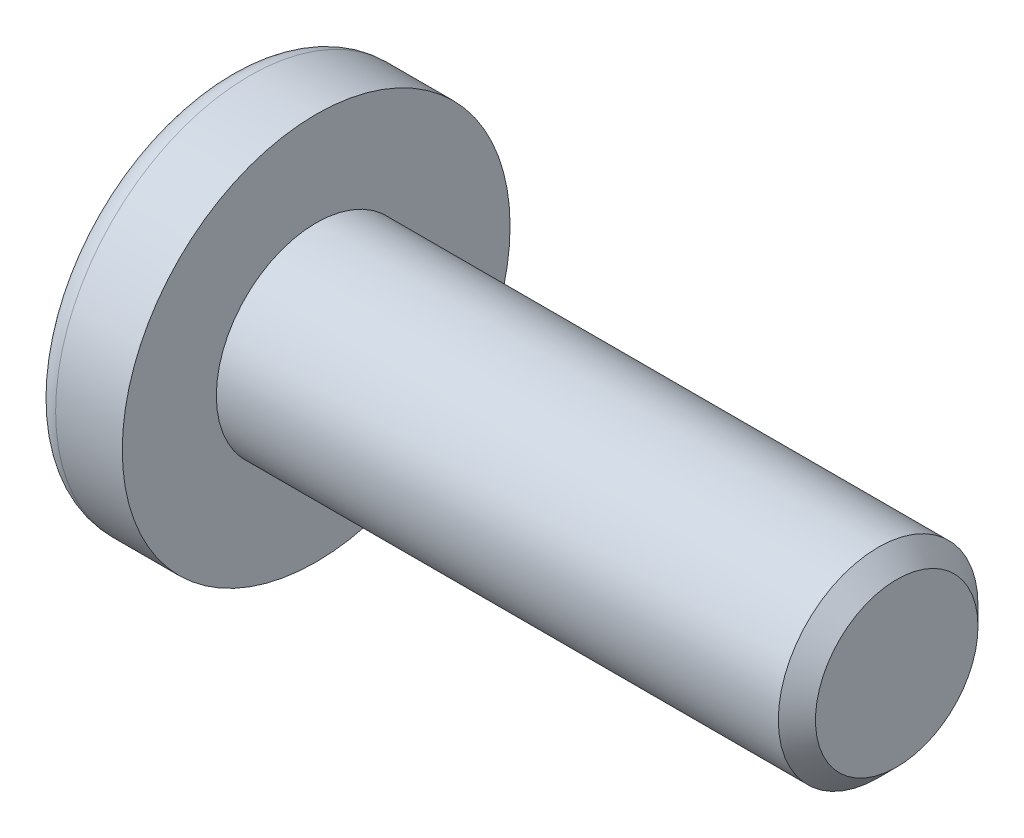
ISO-10303-21;
HEADER;
FILE_DESCRIPTION(('STEP AP214'),'2;1');
FILE_NAME('part.step','',(''),(''),'','','');
FILE_SCHEMA(('AUTOMOTIVE_DESIGN { 1 0 10303 214 1 1 1 1 }'));
ENDSEC;
DATA;
#1=APPLICATION_CONTEXT('core data for automotive mechanical design processes');
#2=APPLICATION_PROTOCOL_DEFINITION('international standard','automotive_design',2000,#1);
#3=PRODUCT_CONTEXT('',#1,'mechanical');
#4=PRODUCT('Part','Part','',(#3));
#5=PRODUCT_RELATED_PRODUCT_CATEGORY('part','',(#4));
#6=PRODUCT_DEFINITION_FORMATION('','',#4);
#7=PRODUCT_DEFINITION_CONTEXT('part definition',#1,'design');
#8=PRODUCT_DEFINITION('design','',#6,#7);
#9=PRODUCT_DEFINITION_SHAPE('','',#8);
#10=(LENGTH_UNIT() NAMED_UNIT(*) SI_UNIT(.MILLI.,.METRE.));
#11=(NAMED_UNIT(*) PLANE_ANGLE_UNIT() SI_UNIT($,.RADIAN.));
#12=(NAMED_UNIT(*) SI_UNIT($,.STERADIAN.) SOLID_ANGLE_UNIT());
#13=UNCERTAINTY_MEASURE_WITH_UNIT(LENGTH_MEASURE(1.E-05),#10,'distance_accuracy_value','');
#14=(GEOMETRIC_REPRESENTATION_CONTEXT(3) GLOBAL_UNCERTAINTY_ASSIGNED_CONTEXT((#13)) GLOBAL_UNIT_ASSIGNED_CONTEXT((#10,
#11,#12)) REPRESENTATION_CONTEXT('',''));
#15=CARTESIAN_POINT('',(0.,0.,0.));
#16=DIRECTION('',(0.,0.,1.));
#17=DIRECTION('',(1.,0.,0.));
#18=AXIS2_PLACEMENT_3D('',#15,#16,#17);
#19=CARTESIAN_POINT('',(3.49504,0.,0.));
#20=DIRECTION('',(-1.,0.,0.));
#21=DIRECTION('',(0.,1.,0.));
#22=AXIS2_PLACEMENT_3D('',#19,#20,#21);
#23=SPHERICAL_SURFACE('',#22,3.49504);
#24=CARTESIAN_POINT('',(0.638066947960321,0.,0.));
#25=DIRECTION('',(-1.,0.,0.));
#26=DIRECTION('',(0.,0.,1.));
#27=AXIS2_PLACEMENT_3D('',#24,#25,#26);
#28=CIRCLE('',#27,2.01320877742947);
#29=CARTESIAN_POINT('',(0.638066947960321,0.,2.01320877742947));
#30=VERTEX_POINT('',#29);
#31=EDGE_CURVE('E143',#30,#30,#28,.T.);
#32=ORIENTED_EDGE('',*,*,#31,.T.);
#33=EDGE_LOOP('',(#32));
#34=FACE_BOUND('',#33,.T.);
#35=CARTESIAN_POINT('',(3.48860800425343,-0.0562204072662827,0.));
#36=DIRECTION('',(-0.113665320353011,-0.99351909641891,0.));
#37=DIRECTION('',(0.99351909641891,-0.113665320353011,0.));
#38=AXIS2_PLACEMENT_3D('',#35,#36,#37);
#39=CIRCLE('',#38,3.49458187725478);
#40=CARTESIAN_POINT('',(0.227775025036725,0.316840992898337,1.19995665346604));
#41=VERTEX_POINT('',#40);
#42=CARTESIAN_POINT('',(0.033060362162214,0.339117670430593,0.339117670430593));
#43=VERTEX_POINT('',#42);
#44=EDGE_CURVE('E139',#41,#43,#39,.T.);
#45=ORIENTED_EDGE('',*,*,#44,.F.);
#46=CARTESIAN_POINT('',(2.78874832810788,0.,-0.872695468934767));
#47=DIRECTION('',(0.629103472698606,0.,0.777321568360582));
#48=DIRECTION('',(0.777321568360582,0.,-0.629103472698606));
#49=AXIS2_PLACEMENT_3D('',#46,#47,#48);
#50=CIRCLE('',#49,3.30981257691679);
#51=CARTESIAN_POINT('',(0.227775025036724,-0.316840992898345,1.19995665346604));
#52=VERTEX_POINT('',#51);
#53=EDGE_CURVE('E131',#41,#52,#50,.T.);
#54=ORIENTED_EDGE('',*,*,#53,.T.);
#55=CARTESIAN_POINT('',(3.48860800425343,0.0562204072662818,0.));
#56=DIRECTION('',(-0.11366532035301,0.99351909641891,0.));
#57=DIRECTION('',(-0.99351909641891,-0.11366532035301,0.));
#58=AXIS2_PLACEMENT_3D('',#55,#56,#57);
#59=CIRCLE('',#58,3.49458187725478);
#60=CARTESIAN_POINT('',(0.0330603621622127,-0.339117670430595,0.339117670430594));
#61=VERTEX_POINT('',#60);
#62=EDGE_CURVE('E383',#61,#52,#59,.T.);
#63=ORIENTED_EDGE('',*,*,#62,.F.);
#64=CARTESIAN_POINT('',(3.48860800425343,0.,-0.0562204072662819));
#65=DIRECTION('',(-0.11366532035301,0.,-0.99351909641891));
#66=DIRECTION('',(-0.99351909641891,0.,0.11366532035301));
#67=AXIS2_PLACEMENT_3D('',#64,#65,#66);
#68=CIRCLE('',#67,3.49458187725478);
#69=CARTESIAN_POINT('',(0.227775025036724,-1.19995665346604,0.316840992898341));
#70=VERTEX_POINT('',#69);
#71=EDGE_CURVE('E177',#70,#61,#68,.T.);
#72=ORIENTED_EDGE('',*,*,#71,.F.);
#73=CARTESIAN_POINT('',(2.78874832810788,0.872695468934764,0.));
#74=DIRECTION('',(0.629103472698606,-0.777321568360582,0.));
#75=DIRECTION('',(0.777321568360582,0.629103472698606,0.));
#76=AXIS2_PLACEMENT_3D('',#73,#74,#75);
#77=CIRCLE('',#76,3.30981257691679);
#78=CARTESIAN_POINT('',(0.227775025036722,-1.19995665346604,-0.316840992898341));
#79=VERTEX_POINT('',#78);
#80=EDGE_CURVE('E173',#70,#79,#77,.T.);
#81=ORIENTED_EDGE('',*,*,#80,.T.);
#82=CARTESIAN_POINT('',(3.48860800425343,0.,0.0562204072662826));
#83=DIRECTION('',(-0.113665320353011,0.,0.99351909641891));
#84=DIRECTION('',(0.99351909641891,0.,0.113665320353011));
#85=AXIS2_PLACEMENT_3D('',#82,#83,#84);
#86=CIRCLE('',#85,3.49458187725478);
#87=CARTESIAN_POINT('',(0.0330603621622127,-0.339117670430592,-0.339117670430594));
#88=VERTEX_POINT('',#87);
#89=EDGE_CURVE('E57',#88,#79,#86,.T.);
#90=ORIENTED_EDGE('',*,*,#89,.F.);
#91=CARTESIAN_POINT('',(0.227775025036724,-0.316840992898336,-1.19995665346604));
#92=VERTEX_POINT('',#91);
#93=EDGE_CURVE('E381',#92,#88,#59,.T.);
#94=ORIENTED_EDGE('',*,*,#93,.F.);
#95=CARTESIAN_POINT('',(2.78874832810788,0.,0.872695468934766));
#96=DIRECTION('',(0.629103472698606,0.,-0.777321568360582));
#97=DIRECTION('',(-0.777321568360582,0.,-0.629103472698606));
#98=AXIS2_PLACEMENT_3D('',#95,#96,#97);
#99=CIRCLE('',#98,3.30981257691679);
#100=CARTESIAN_POINT('',(0.227775025036724,0.316840992898345,-1.19995665346604));
#101=VERTEX_POINT('',#100);
#102=EDGE_CURVE('E388',#92,#101,#99,.T.);
#103=ORIENTED_EDGE('',*,*,#102,.T.);
#104=CARTESIAN_POINT('',(0.033060362162214,0.339117670430595,-0.339117670430594));
#105=VERTEX_POINT('',#104);
#106=EDGE_CURVE('E116',#105,#101,#39,.T.);
#107=ORIENTED_EDGE('',*,*,#106,.F.);
#108=CARTESIAN_POINT('',(0.227775025036726,1.19995665346604,-0.316840992898341));
#109=VERTEX_POINT('',#108);
#110=EDGE_CURVE('E138',#109,#105,#86,.T.);
#111=ORIENTED_EDGE('',*,*,#110,.F.);
#112=CARTESIAN_POINT('',(2.78874832810788,-0.872695468934769,0.));
#113=DIRECTION('',(0.629103472698606,0.777321568360582,0.));
#114=DIRECTION('',(-0.777321568360582,0.629103472698606,0.));
#115=AXIS2_PLACEMENT_3D('',#112,#113,#114);
#116=CIRCLE('',#115,3.30981257691679);
#117=CARTESIAN_POINT('',(0.227775025036726,1.19995665346604,0.31684099289834));
#118=VERTEX_POINT('',#117);
#119=EDGE_CURVE('E65',#109,#118,#116,.T.);
#120=ORIENTED_EDGE('',*,*,#119,.T.);
#121=EDGE_CURVE('E176',#43,#118,#68,.T.);
#122=ORIENTED_EDGE('',*,*,#121,.F.);
#123=EDGE_LOOP('',(#45,#54,#63,#72,#81,#90,#94,#103,#107,#111,#120,#122));
#124=FACE_BOUND('',#123,.T.);
#125=ADVANCED_FACE('F42',(#34,#124),#23,.T.);
#126=CARTESIAN_POINT('',(1.71044397905759,0.,-0.147213612565445));
#127=DIRECTION('',(-0.113665320353011,0.,0.99351909641891));
#128=DIRECTION('',(0.99351909641891,0.,0.113665320353011));
#129=AXIS2_PLACEMENT_3D('',#126,#127,#128);
#130=PLANE('',#129);
#131=ORIENTED_EDGE('',*,*,#110,.T.);
#132=DIRECTION('',(0.987162587649563,-0.112938092654823,0.112938092654823));
#133=VECTOR('',#132,1.);
#134=CARTESIAN_POINT('',(1.72685656853982,0.145335901056886,-0.145335901056885));
#135=LINE('',#134,#133);
#136=CARTESIAN_POINT('',(1.4986,0.171450000000001,-0.17145));
#137=VERTEX_POINT('',#136);
#138=EDGE_CURVE('E114',#105,#137,#135,.T.);
#139=ORIENTED_EDGE('',*,*,#138,.T.);
#140=DIRECTION('',(0.774265880811046,-0.626630437436058,0.0885812660249925));
#141=VECTOR('',#140,1.);
#142=CARTESIAN_POINT('',(0.,1.3843,-0.3429));
#143=LINE('',#142,#141);
#144=EDGE_CURVE('E136',#109,#137,#143,.T.);
#145=ORIENTED_EDGE('',*,*,#144,.F.);
#146=EDGE_LOOP('',(#131,#139,#145));
#147=FACE_BOUND('',#146,.T.);
#148=ADVANCED_FACE('F135',(#147),#130,.T.);
#149=DIRECTION('',(0.774265880811046,0.626630437436058,0.0885812660249925));
#150=VECTOR('',#149,1.);
#151=CARTESIAN_POINT('',(0.,-1.3843,-0.3429));
#152=LINE('',#151,#150);
#153=CARTESIAN_POINT('',(1.4986,-0.17145,-0.17145));
#154=VERTEX_POINT('',#153);
#155=EDGE_CURVE('E158',#79,#154,#152,.T.);
#156=ORIENTED_EDGE('',*,*,#155,.T.);
#157=DIRECTION('',(-0.987162587649563,-0.112938092654822,-0.112938092654823));
#158=VECTOR('',#157,1.);
#159=CARTESIAN_POINT('',(1.72685656853982,-0.145335901056885,-0.145335901056885));
#160=LINE('',#159,#158);
#161=EDGE_CURVE('E372',#154,#88,#160,.T.);
#162=ORIENTED_EDGE('',*,*,#161,.T.);
#163=ORIENTED_EDGE('',*,*,#89,.T.);
#164=EDGE_LOOP('',(#156,#162,#163));
#165=FACE_BOUND('',#164,.T.);
#166=ADVANCED_FACE('F206',(#165),#130,.T.);
#167=CARTESIAN_POINT('',(1.71044397905759,0.,0.147213612565445));
#168=DIRECTION('',(-0.11366532035301,0.,-0.99351909641891));
#169=DIRECTION('',(-0.99351909641891,0.,0.11366532035301));
#170=AXIS2_PLACEMENT_3D('',#167,#168,#169);
#171=PLANE('',#170);
#172=DIRECTION('',(0.774265880811046,-0.626630437436058,-0.0885812660249922));
#173=VECTOR('',#172,1.);
#174=CARTESIAN_POINT('',(0.,1.3843,0.342899999999999));
#175=LINE('',#174,#173);
#176=CARTESIAN_POINT('',(1.4986,0.17145,0.17145));
#177=VERTEX_POINT('',#176);
#178=EDGE_CURVE('E144',#118,#177,#175,.T.);
#179=ORIENTED_EDGE('',*,*,#178,.T.);
#180=DIRECTION('',(-0.987162587649563,0.112938092654822,0.112938092654822));
#181=VECTOR('',#180,1.);
#182=CARTESIAN_POINT('',(1.72685656853981,0.145335901056885,0.145335901056886));
#183=LINE('',#182,#181);
#184=EDGE_CURVE('E378',#177,#43,#183,.T.);
#185=ORIENTED_EDGE('',*,*,#184,.T.);
#186=ORIENTED_EDGE('',*,*,#121,.T.);
#187=EDGE_LOOP('',(#179,#185,#186));
#188=FACE_BOUND('',#187,.T.);
#189=ADVANCED_FACE('F237',(#188),#171,.T.);
#190=ORIENTED_EDGE('',*,*,#71,.T.);
#191=DIRECTION('',(0.987162587649563,0.112938092654823,-0.112938092654822));
#192=VECTOR('',#191,1.);
#193=CARTESIAN_POINT('',(1.72685656853982,-0.145335901056886,0.145335901056886));
#194=LINE('',#193,#192);
#195=CARTESIAN_POINT('',(1.4986,-0.171450000000001,0.171449999999999));
#196=VERTEX_POINT('',#195);
#197=EDGE_CURVE('E385',#61,#196,#194,.T.);
#198=ORIENTED_EDGE('',*,*,#197,.T.);
#199=DIRECTION('',(0.774265880811046,0.626630437436058,-0.0885812660249922));
#200=VECTOR('',#199,1.);
#201=CARTESIAN_POINT('',(0.,-1.3843,0.342899999999999));
#202=LINE('',#201,#200);
#203=EDGE_CURVE('E155',#70,#196,#202,.T.);
#204=ORIENTED_EDGE('',*,*,#203,.F.);
#205=EDGE_LOOP('',(#190,#198,#204));
#206=FACE_BOUND('',#205,.T.);
#207=ADVANCED_FACE('F226',(#206),#171,.T.);
#208=CARTESIAN_POINT('',(-25.4,0.,0.));
#209=DIRECTION('',(-1.,0.,0.));
#210=DIRECTION('',(0.,0.,1.));
#211=AXIS2_PLACEMENT_3D('',#208,#209,#210);
#212=CYLINDRICAL_SURFACE('',#211,1.0922);
#213=CARTESIAN_POINT('',(7.7216,0.,0.));
#214=DIRECTION('',(1.,0.,0.));
#215=DIRECTION('',(0.,0.,-1.));
#216=AXIS2_PLACEMENT_3D('',#213,#214,#215);
#217=CIRCLE('',#216,1.0922);
#218=CARTESIAN_POINT('',(7.7216,0.,-1.0922));
#219=VERTEX_POINT('',#218);
#220=EDGE_CURVE('E50',#219,#219,#217,.F.);
#221=ORIENTED_EDGE('',*,*,#220,.T.);
#222=EDGE_LOOP('',(#221));
#223=FACE_BOUND('',#222,.T.);
#224=CARTESIAN_POINT('',(1.5748,0.,0.));
#225=DIRECTION('',(-1.,0.,0.));
#226=DIRECTION('',(0.,0.,1.));
#227=AXIS2_PLACEMENT_3D('',#224,#225,#226);
#228=CIRCLE('',#227,1.0922);
#229=CARTESIAN_POINT('',(1.5748,0.,1.0922));
#230=VERTEX_POINT('',#229);
#231=EDGE_CURVE('E170',#230,#230,#228,.T.);
#232=ORIENTED_EDGE('',*,*,#231,.F.);
#233=EDGE_LOOP('',(#232));
#234=FACE_BOUND('',#233,.T.);
#235=ADVANCED_FACE('F44',(#223,#234),#212,.T.);
#236=CARTESIAN_POINT('',(1.5748,1.0922,0.));
#237=DIRECTION('',(-1.,0.,0.));
#238=DIRECTION('',(0.,0.,1.));
#239=AXIS2_PLACEMENT_3D('',#236,#237,#238);
#240=PLANE('',#239);
#241=CARTESIAN_POINT('',(1.5748,0.,0.));
#242=DIRECTION('',(-1.,0.,0.));
#243=DIRECTION('',(0.,0.,1.));
#244=AXIS2_PLACEMENT_3D('',#241,#242,#243);
#245=CIRCLE('',#244,2.1209);
#246=CARTESIAN_POINT('',(1.5748,0.,2.1209));
#247=VERTEX_POINT('',#246);
#248=EDGE_CURVE('E167',#247,#247,#245,.T.);
#249=ORIENTED_EDGE('',*,*,#248,.F.);
#250=EDGE_LOOP('',(#249));
#251=FACE_BOUND('',#250,.T.);
#252=ORIENTED_EDGE('',*,*,#231,.T.);
#253=EDGE_LOOP('',(#252));
#254=FACE_BOUND('',#253,.T.);
#255=ADVANCED_FACE('F219',(#251,#254),#240,.F.);
#256=CARTESIAN_POINT('',(-25.4,0.,0.));
#257=DIRECTION('',(-1.,0.,0.));
#258=DIRECTION('',(0.,0.,1.));
#259=AXIS2_PLACEMENT_3D('',#256,#257,#258);
#260=CYLINDRICAL_SURFACE('',#259,2.1209);
#261=ORIENTED_EDGE('',*,*,#248,.T.);
#262=EDGE_LOOP('',(#261));
#263=FACE_BOUND('',#262,.T.);
#264=CARTESIAN_POINT('',(0.845695803486458,0.,0.));
#265=DIRECTION('',(-1.,0.,0.));
#266=DIRECTION('',(0.,0.,1.));
#267=AXIS2_PLACEMENT_3D('',#264,#265,#266);
#268=CIRCLE('',#267,2.1209);
#269=CARTESIAN_POINT('',(0.845695803486458,0.,2.1209));
#270=VERTEX_POINT('',#269);
#271=EDGE_CURVE('E164',#270,#270,#268,.T.);
#272=ORIENTED_EDGE('',*,*,#271,.F.);
#273=EDGE_LOOP('',(#272));
#274=FACE_BOUND('',#273,.T.);
#275=ADVANCED_FACE('F216',(#263,#274),#260,.T.);
#276=CARTESIAN_POINT('',(0.845695803486459,0.,0.));
#277=DIRECTION('',(-1.,0.,0.));
#278=DIRECTION('',(0.,0.,1.));
#279=AXIS2_PLACEMENT_3D('',#276,#277,#278);
#280=TOROIDAL_SURFACE('',#279,1.8669,0.254000000000001);
#281=ORIENTED_EDGE('',*,*,#271,.T.);
#282=EDGE_LOOP('',(#281));
#283=FACE_BOUND('',#282,.T.);
#284=ORIENTED_EDGE('',*,*,#31,.F.);
#285=EDGE_LOOP('',(#284));
#286=FACE_BOUND('',#285,.T.);
#287=ADVANCED_FACE('F213',(#283,#286),#280,.T.);
#288=CARTESIAN_POINT('',(7.9248,1.0922,0.));
#289=DIRECTION('',(1.,0.,0.));
#290=DIRECTION('',(0.,0.,-1.));
#291=AXIS2_PLACEMENT_3D('',#288,#289,#290);
#292=PLANE('',#291);
#293=CARTESIAN_POINT('',(7.9248,0.,0.));
#294=DIRECTION('',(1.,0.,0.));
#295=DIRECTION('',(0.,0.,-1.));
#296=AXIS2_PLACEMENT_3D('',#293,#294,#295);
#297=CIRCLE('',#296,0.888999999999997);
#298=CARTESIAN_POINT('',(7.9248,0.,-0.888999999999997));
#299=VERTEX_POINT('',#298);
#300=EDGE_CURVE('E11',#299,#299,#297,.T.);
#301=ORIENTED_EDGE('',*,*,#300,.T.);
#302=EDGE_LOOP('',(#301));
#303=FACE_BOUND('',#302,.T.);
#304=ADVANCED_FACE('F211',(#303),#292,.T.);
#305=CARTESIAN_POINT('',(1.4986,0.17145,0.17145));
#306=DIRECTION('',(0.629103472698606,0.777321568360582,0.));
#307=DIRECTION('',(-0.777321568360582,0.629103472698606,0.));
#308=AXIS2_PLACEMENT_3D('',#305,#306,#307);
#309=PLANE('',#308);
#310=ORIENTED_EDGE('',*,*,#144,.T.);
#311=DIRECTION('',(0.,0.,-1.));
#312=VECTOR('',#311,1.);
#313=CARTESIAN_POINT('',(1.4986,0.17145,0.17145));
#314=LINE('',#313,#312);
#315=EDGE_CURVE('E130',#177,#137,#314,.T.);
#316=ORIENTED_EDGE('',*,*,#315,.F.);
#317=ORIENTED_EDGE('',*,*,#178,.F.);
#318=ORIENTED_EDGE('',*,*,#119,.F.);
#319=EDGE_LOOP('',(#310,#316,#317,#318));
#320=FACE_BOUND('',#319,.T.);
#321=ADVANCED_FACE('F142',(#320),#309,.F.);
#322=CARTESIAN_POINT('',(0.,-1.3843,-0.3429));
#323=DIRECTION('',(0.629103472698606,-0.777321568360582,0.));
#324=DIRECTION('',(0.777321568360582,0.629103472698606,0.));
#325=AXIS2_PLACEMENT_3D('',#322,#323,#324);
#326=PLANE('',#325);
#327=ORIENTED_EDGE('',*,*,#203,.T.);
#328=DIRECTION('',(0.,0.,1.));
#329=VECTOR('',#328,1.);
#330=CARTESIAN_POINT('',(1.4986,-0.17145,-0.17145));
#331=LINE('',#330,#329);
#332=EDGE_CURVE('E151',#154,#196,#331,.T.);
#333=ORIENTED_EDGE('',*,*,#332,.F.);
#334=ORIENTED_EDGE('',*,*,#155,.F.);
#335=ORIENTED_EDGE('',*,*,#80,.F.);
#336=EDGE_LOOP('',(#327,#333,#334,#335));
#337=FACE_BOUND('',#336,.T.);
#338=ADVANCED_FACE('F245',(#337),#326,.F.);
#339=CARTESIAN_POINT('',(1.4986,0.17145,-0.17145));
#340=DIRECTION('',(-1.,0.,0.));
#341=DIRECTION('',(0.,0.,1.));
#342=AXIS2_PLACEMENT_3D('',#339,#340,#341);
#343=PLANE('',#342);
#344=DIRECTION('',(0.,1.,0.));
#345=VECTOR('',#344,1.);
#346=CARTESIAN_POINT('',(1.4986,-0.17145,-0.17145));
#347=LINE('',#346,#345);
#348=EDGE_CURVE('E123',#154,#137,#347,.T.);
#349=ORIENTED_EDGE('',*,*,#348,.F.);
#350=ORIENTED_EDGE('',*,*,#332,.T.);
#351=DIRECTION('',(0.,-1.,0.));
#352=VECTOR('',#351,1.);
#353=CARTESIAN_POINT('',(1.4986,0.17145,0.17145));
#354=LINE('',#353,#352);
#355=EDGE_CURVE('E149',#177,#196,#354,.T.);
#356=ORIENTED_EDGE('',*,*,#355,.F.);
#357=ORIENTED_EDGE('',*,*,#315,.T.);
#358=EDGE_LOOP('',(#349,#350,#356,#357));
#359=FACE_BOUND('',#358,.T.);
#360=ADVANCED_FACE('F147',(#359),#343,.T.);
#361=CARTESIAN_POINT('',(0.,0.342900000000005,-1.3843));
#362=DIRECTION('',(0.629103472698606,0.,-0.777321568360582));
#363=DIRECTION('',(0.777321568360582,0.,0.629103472698606));
#364=AXIS2_PLACEMENT_3D('',#361,#362,#363);
#365=PLANE('',#364);
#366=DIRECTION('',(0.774265880811046,0.08858126602499,0.626630437436058));
#367=VECTOR('',#366,1.);
#368=CARTESIAN_POINT('',(0.,-0.342899999999994,-1.3843));
#369=LINE('',#368,#367);
#370=EDGE_CURVE('E120',#92,#154,#369,.T.);
#371=ORIENTED_EDGE('',*,*,#370,.T.);
#372=ORIENTED_EDGE('',*,*,#348,.T.);
#373=DIRECTION('',(0.774265880811046,-0.0885812660249947,0.626630437436057));
#374=VECTOR('',#373,1.);
#375=CARTESIAN_POINT('',(0.,0.342900000000005,-1.3843));
#376=LINE('',#375,#374);
#377=EDGE_CURVE('E110',#101,#137,#376,.T.);
#378=ORIENTED_EDGE('',*,*,#377,.F.);
#379=ORIENTED_EDGE('',*,*,#102,.F.);
#380=EDGE_LOOP('',(#371,#372,#378,#379));
#381=FACE_BOUND('',#380,.T.);
#382=ADVANCED_FACE('F124',(#381),#365,.F.);
#383=CARTESIAN_POINT('',(1.71044397905759,-0.147213612565445,0.));
#384=DIRECTION('',(-0.11366532035301,0.99351909641891,0.));
#385=DIRECTION('',(-0.99351909641891,-0.11366532035301,0.));
#386=AXIS2_PLACEMENT_3D('',#383,#384,#385);
#387=PLANE('',#386);
#388=ORIENTED_EDGE('',*,*,#93,.T.);
#389=ORIENTED_EDGE('',*,*,#161,.F.);
#390=ORIENTED_EDGE('',*,*,#370,.F.);
#391=EDGE_LOOP('',(#388,#389,#390));
#392=FACE_BOUND('',#391,.T.);
#393=ADVANCED_FACE('F197',(#392),#387,.T.);
#394=CARTESIAN_POINT('',(1.71044397905759,0.147213612565445,0.));
#395=DIRECTION('',(-0.113665320353011,-0.99351909641891,0.));
#396=DIRECTION('',(0.99351909641891,-0.113665320353011,0.));
#397=AXIS2_PLACEMENT_3D('',#394,#395,#396);
#398=PLANE('',#397);
#399=ORIENTED_EDGE('',*,*,#106,.T.);
#400=ORIENTED_EDGE('',*,*,#377,.T.);
#401=ORIENTED_EDGE('',*,*,#138,.F.);
#402=EDGE_LOOP('',(#399,#400,#401));
#403=FACE_BOUND('',#402,.T.);
#404=ADVANCED_FACE('F112',(#403),#398,.T.);
#405=CARTESIAN_POINT('',(1.4986,-0.171450000000001,0.171449999999999));
#406=DIRECTION('',(0.629103472698606,0.,0.777321568360582));
#407=DIRECTION('',(-0.777321568360582,0.,0.629103472698606));
#408=AXIS2_PLACEMENT_3D('',#405,#406,#407);
#409=PLANE('',#408);
#410=DIRECTION('',(0.774265880811046,-0.0885812660249903,-0.626630437436058));
#411=VECTOR('',#410,1.);
#412=CARTESIAN_POINT('',(0.,0.342899999999995,1.3843));
#413=LINE('',#412,#411);
#414=EDGE_CURVE('E390',#41,#177,#413,.T.);
#415=ORIENTED_EDGE('',*,*,#414,.T.);
#416=ORIENTED_EDGE('',*,*,#355,.T.);
#417=DIRECTION('',(0.774265880811046,0.0885812660249944,-0.626630437436058));
#418=VECTOR('',#417,1.);
#419=CARTESIAN_POINT('',(0.,-0.342900000000004,1.3843));
#420=LINE('',#419,#418);
#421=EDGE_CURVE('E119',#52,#196,#420,.T.);
#422=ORIENTED_EDGE('',*,*,#421,.F.);
#423=ORIENTED_EDGE('',*,*,#53,.F.);
#424=EDGE_LOOP('',(#415,#416,#422,#423));
#425=FACE_BOUND('',#424,.T.);
#426=ADVANCED_FACE('F291',(#425),#409,.F.);
#427=ORIENTED_EDGE('',*,*,#44,.T.);
#428=ORIENTED_EDGE('',*,*,#184,.F.);
#429=ORIENTED_EDGE('',*,*,#414,.F.);
#430=EDGE_LOOP('',(#427,#428,#429));
#431=FACE_BOUND('',#430,.T.);
#432=ADVANCED_FACE('F194',(#431),#398,.T.);
#433=ORIENTED_EDGE('',*,*,#62,.T.);
#434=ORIENTED_EDGE('',*,*,#421,.T.);
#435=ORIENTED_EDGE('',*,*,#197,.F.);
#436=EDGE_LOOP('',(#433,#434,#435));
#437=FACE_BOUND('',#436,.T.);
#438=ADVANCED_FACE('F188',(#437),#387,.T.);
#439=CARTESIAN_POINT('',(7.7216,0.,0.));
#440=DIRECTION('',(-1.,0.,0.));
#441=DIRECTION('',(0.,0.,1.));
#442=AXIS2_PLACEMENT_3D('',#439,#440,#441);
#443=CONICAL_SURFACE('',#442,1.0922,0.785398163397455);
#444=ORIENTED_EDGE('',*,*,#300,.F.);
#445=EDGE_LOOP('',(#444));
#446=FACE_BOUND('',#445,.T.);
#447=ORIENTED_EDGE('',*,*,#220,.F.);
#448=EDGE_LOOP('',(#447));
#449=FACE_BOUND('',#448,.T.);
#450=ADVANCED_FACE('F186',(#446,#449),#443,.T.);
#451=CLOSED_SHELL('',(#125,#148,#166,#189,#207,#235,#255,#275,#287,#304,#321,#338,#360,#382,
#393,#404,#426,#432,#438,#450));
#452=MANIFOLD_SOLID_BREP('B2',#451);
#453=ADVANCED_BREP_SHAPE_REPRESENTATION('',(#18,#452),#14);
#454=SHAPE_DEFINITION_REPRESENTATION(#9,#453);
ENDSEC;
END-ISO-10303-21;
